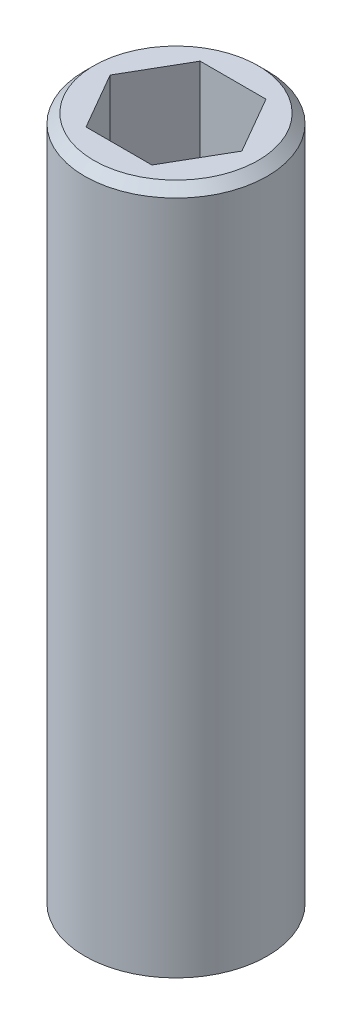
ISO-10303-21;
HEADER;
FILE_DESCRIPTION(('STEP AP214'),'2;1');
FILE_NAME('part.step','',(''),(''),'','','');
FILE_SCHEMA(('AUTOMOTIVE_DESIGN { 1 0 10303 214 1 1 1 1 }'));
ENDSEC;
DATA;
#1=APPLICATION_CONTEXT('core data for automotive mechanical design processes');
#2=APPLICATION_PROTOCOL_DEFINITION('international standard','automotive_design',2000,#1);
#3=PRODUCT_CONTEXT('',#1,'mechanical');
#4=PRODUCT('Part','Part','',(#3));
#5=PRODUCT_RELATED_PRODUCT_CATEGORY('part','',(#4));
#6=PRODUCT_DEFINITION_FORMATION('','',#4);
#7=PRODUCT_DEFINITION_CONTEXT('part definition',#1,'design');
#8=PRODUCT_DEFINITION('design','',#6,#7);
#9=PRODUCT_DEFINITION_SHAPE('','',#8);
#10=(LENGTH_UNIT() NAMED_UNIT(*) SI_UNIT(.MILLI.,.METRE.));
#11=(NAMED_UNIT(*) PLANE_ANGLE_UNIT() SI_UNIT($,.RADIAN.));
#12=(NAMED_UNIT(*) SI_UNIT($,.STERADIAN.) SOLID_ANGLE_UNIT());
#13=UNCERTAINTY_MEASURE_WITH_UNIT(LENGTH_MEASURE(1.E-05),#10,'distance_accuracy_value','');
#14=(GEOMETRIC_REPRESENTATION_CONTEXT(3) GLOBAL_UNCERTAINTY_ASSIGNED_CONTEXT((#13)) GLOBAL_UNIT_ASSIGNED_CONTEXT((#10,
#11,#12)) REPRESENTATION_CONTEXT('',''));
#15=CARTESIAN_POINT('',(0.,0.,0.));
#16=DIRECTION('',(0.,0.,1.));
#17=DIRECTION('',(1.,0.,0.));
#18=AXIS2_PLACEMENT_3D('',#15,#16,#17);
#19=CARTESIAN_POINT('',(0.,7.5,0.));
#20=DIRECTION('',(0.,-1.,0.));
#21=DIRECTION('',(0.,0.,-1.));
#22=AXIS2_PLACEMENT_3D('',#19,#20,#21);
#23=CYLINDRICAL_SURFACE('',#22,2.);
#24=CARTESIAN_POINT('',(0.,7.3,0.));
#25=DIRECTION('',(0.,1.,0.));
#26=DIRECTION('',(0.,0.,1.));
#27=AXIS2_PLACEMENT_3D('',#24,#25,#26);
#28=CIRCLE('',#27,2.);
#29=CARTESIAN_POINT('',(0.,7.3,2.));
#30=VERTEX_POINT('',#29);
#31=EDGE_CURVE('E11',#30,#30,#28,.F.);
#32=ORIENTED_EDGE('',*,*,#31,.T.);
#33=EDGE_LOOP('',(#32));
#34=FACE_BOUND('',#33,.T.);
#35=CARTESIAN_POINT('',(0.,-7.5,0.));
#36=DIRECTION('',(0.,1.,0.));
#37=DIRECTION('',(0.,0.,1.));
#38=AXIS2_PLACEMENT_3D('',#35,#36,#37);
#39=CIRCLE('',#38,2.);
#40=CARTESIAN_POINT('',(0.,-7.5,2.));
#41=VERTEX_POINT('',#40);
#42=EDGE_CURVE('E141',#41,#41,#39,.T.);
#43=ORIENTED_EDGE('',*,*,#42,.T.);
#44=EDGE_LOOP('',(#43));
#45=FACE_BOUND('',#44,.T.);
#46=ADVANCED_FACE('F39',(#34,#45),#23,.T.);
#47=CARTESIAN_POINT('',(0.,7.5,0.));
#48=DIRECTION('',(0.,1.,0.));
#49=DIRECTION('',(0.,0.,1.));
#50=AXIS2_PLACEMENT_3D('',#47,#48,#49);
#51=PLANE('',#50);
#52=CARTESIAN_POINT('',(0.,7.5,0.));
#53=DIRECTION('',(0.,1.,0.));
#54=DIRECTION('',(0.,0.,1.));
#55=AXIS2_PLACEMENT_3D('',#52,#53,#54);
#56=CIRCLE('',#55,1.8);
#57=CARTESIAN_POINT('',(0.,7.5,1.8));
#58=VERTEX_POINT('',#57);
#59=EDGE_CURVE('E47',#58,#58,#56,.T.);
#60=ORIENTED_EDGE('',*,*,#59,.T.);
#61=EDGE_LOOP('',(#60));
#62=FACE_BOUND('',#61,.T.);
#63=DIRECTION('',(-0.5,0.,-0.866025403784439));
#64=VECTOR('',#63,1.);
#65=CARTESIAN_POINT('',(1.44337567297406,7.5,0.));
#66=LINE('',#65,#64);
#67=CARTESIAN_POINT('',(1.44337567297406,7.5,0.));
#68=VERTEX_POINT('',#67);
#69=CARTESIAN_POINT('',(0.721687836487032,7.5,-1.25));
#70=VERTEX_POINT('',#69);
#71=EDGE_CURVE('E54',#68,#70,#66,.T.);
#72=ORIENTED_EDGE('',*,*,#71,.F.);
#73=DIRECTION('',(0.5,0.,-0.866025403784439));
#74=VECTOR('',#73,1.);
#75=CARTESIAN_POINT('',(0.721687836487032,7.5,1.25));
#76=LINE('',#75,#74);
#77=CARTESIAN_POINT('',(0.721687836487032,7.5,1.25));
#78=VERTEX_POINT('',#77);
#79=EDGE_CURVE('E137',#78,#68,#76,.T.);
#80=ORIENTED_EDGE('',*,*,#79,.F.);
#81=DIRECTION('',(1.,0.,0.));
#82=VECTOR('',#81,1.);
#83=CARTESIAN_POINT('',(-0.721687836487032,7.5,1.25));
#84=LINE('',#83,#82);
#85=CARTESIAN_POINT('',(-0.721687836487032,7.5,1.25));
#86=VERTEX_POINT('',#85);
#87=EDGE_CURVE('E135',#86,#78,#84,.T.);
#88=ORIENTED_EDGE('',*,*,#87,.F.);
#89=DIRECTION('',(0.5,0.,0.866025403784439));
#90=VECTOR('',#89,1.);
#91=CARTESIAN_POINT('',(-1.44337567297406,7.5,0.));
#92=LINE('',#91,#90);
#93=CARTESIAN_POINT('',(-1.44337567297406,7.5,0.));
#94=VERTEX_POINT('',#93);
#95=EDGE_CURVE('E102',#94,#86,#92,.T.);
#96=ORIENTED_EDGE('',*,*,#95,.F.);
#97=DIRECTION('',(-0.5,0.,0.866025403784439));
#98=VECTOR('',#97,1.);
#99=CARTESIAN_POINT('',(-0.721687836487032,7.5,-1.25));
#100=LINE('',#99,#98);
#101=CARTESIAN_POINT('',(-0.721687836487032,7.5,-1.25));
#102=VERTEX_POINT('',#101);
#103=EDGE_CURVE('E131',#102,#94,#100,.T.);
#104=ORIENTED_EDGE('',*,*,#103,.F.);
#105=DIRECTION('',(-1.,0.,0.));
#106=VECTOR('',#105,1.);
#107=CARTESIAN_POINT('',(0.721687836487032,7.5,-1.25));
#108=LINE('',#107,#106);
#109=EDGE_CURVE('E128',#70,#102,#108,.T.);
#110=ORIENTED_EDGE('',*,*,#109,.F.);
#111=EDGE_LOOP('',(#72,#80,#88,#96,#104,#110));
#112=FACE_BOUND('',#111,.T.);
#113=ADVANCED_FACE('F151',(#62,#112),#51,.T.);
#114=CARTESIAN_POINT('',(0.,-7.5,0.));
#115=DIRECTION('',(0.,1.,0.));
#116=DIRECTION('',(0.,0.,1.));
#117=AXIS2_PLACEMENT_3D('',#114,#115,#116);
#118=PLANE('',#117);
#119=ORIENTED_EDGE('',*,*,#42,.F.);
#120=EDGE_LOOP('',(#119));
#121=FACE_BOUND('',#120,.T.);
#122=ADVANCED_FACE('F167',(#121),#118,.F.);
#123=CARTESIAN_POINT('',(1.44337567297406,5.5,0.));
#124=DIRECTION('',(0.866025403784439,0.,-0.5));
#125=DIRECTION('',(-0.5,0.,-0.866025403784439));
#126=AXIS2_PLACEMENT_3D('',#123,#124,#125);
#127=PLANE('',#126);
#128=ORIENTED_EDGE('',*,*,#71,.T.);
#129=DIRECTION('',(0.,1.,0.));
#130=VECTOR('',#129,1.);
#131=CARTESIAN_POINT('',(0.721687836487032,5.5,-1.25));
#132=LINE('',#131,#130);
#133=CARTESIAN_POINT('',(0.721687836487032,5.5,-1.25));
#134=VERTEX_POINT('',#133);
#135=EDGE_CURVE('E84',#134,#70,#132,.T.);
#136=ORIENTED_EDGE('',*,*,#135,.F.);
#137=DIRECTION('',(-0.5,0.,-0.866025403784439));
#138=VECTOR('',#137,1.);
#139=CARTESIAN_POINT('',(1.44337567297406,5.5,0.));
#140=LINE('',#139,#138);
#141=CARTESIAN_POINT('',(1.44337567297406,5.5,0.));
#142=VERTEX_POINT('',#141);
#143=EDGE_CURVE('E139',#142,#134,#140,.T.);
#144=ORIENTED_EDGE('',*,*,#143,.F.);
#145=DIRECTION('',(0.,1.,0.));
#146=VECTOR('',#145,1.);
#147=CARTESIAN_POINT('',(1.44337567297406,5.5,0.));
#148=LINE('',#147,#146);
#149=EDGE_CURVE('E62',#142,#68,#148,.T.);
#150=ORIENTED_EDGE('',*,*,#149,.T.);
#151=EDGE_LOOP('',(#128,#136,#144,#150));
#152=FACE_BOUND('',#151,.T.);
#153=ADVANCED_FACE('F172',(#152),#127,.F.);
#154=CARTESIAN_POINT('',(0.721687836487032,5.5,1.25));
#155=DIRECTION('',(0.866025403784439,0.,0.5));
#156=DIRECTION('',(0.5,0.,-0.866025403784439));
#157=AXIS2_PLACEMENT_3D('',#154,#155,#156);
#158=PLANE('',#157);
#159=ORIENTED_EDGE('',*,*,#79,.T.);
#160=ORIENTED_EDGE('',*,*,#149,.F.);
#161=DIRECTION('',(0.5,0.,-0.866025403784439));
#162=VECTOR('',#161,1.);
#163=CARTESIAN_POINT('',(0.721687836487032,5.5,1.25));
#164=LINE('',#163,#162);
#165=CARTESIAN_POINT('',(0.721687836487032,5.5,1.25));
#166=VERTEX_POINT('',#165);
#167=EDGE_CURVE('E114',#166,#142,#164,.T.);
#168=ORIENTED_EDGE('',*,*,#167,.F.);
#169=DIRECTION('',(0.,1.,0.));
#170=VECTOR('',#169,1.);
#171=CARTESIAN_POINT('',(0.721687836487032,5.5,1.25));
#172=LINE('',#171,#170);
#173=EDGE_CURVE('E106',#166,#78,#172,.T.);
#174=ORIENTED_EDGE('',*,*,#173,.T.);
#175=EDGE_LOOP('',(#159,#160,#168,#174));
#176=FACE_BOUND('',#175,.T.);
#177=ADVANCED_FACE('F177',(#176),#158,.F.);
#178=CARTESIAN_POINT('',(-0.721687836487032,5.5,1.25));
#179=DIRECTION('',(0.,0.,1.));
#180=DIRECTION('',(1.,0.,0.));
#181=AXIS2_PLACEMENT_3D('',#178,#179,#180);
#182=PLANE('',#181);
#183=ORIENTED_EDGE('',*,*,#87,.T.);
#184=ORIENTED_EDGE('',*,*,#173,.F.);
#185=DIRECTION('',(1.,0.,0.));
#186=VECTOR('',#185,1.);
#187=CARTESIAN_POINT('',(-0.721687836487032,5.5,1.25));
#188=LINE('',#187,#186);
#189=CARTESIAN_POINT('',(-0.721687836487032,5.5,1.25));
#190=VERTEX_POINT('',#189);
#191=EDGE_CURVE('E110',#190,#166,#188,.T.);
#192=ORIENTED_EDGE('',*,*,#191,.F.);
#193=DIRECTION('',(0.,1.,0.));
#194=VECTOR('',#193,1.);
#195=CARTESIAN_POINT('',(-0.721687836487032,5.5,1.25));
#196=LINE('',#195,#194);
#197=EDGE_CURVE('E95',#190,#86,#196,.T.);
#198=ORIENTED_EDGE('',*,*,#197,.T.);
#199=EDGE_LOOP('',(#183,#184,#192,#198));
#200=FACE_BOUND('',#199,.T.);
#201=ADVANCED_FACE('F111',(#200),#182,.F.);
#202=CARTESIAN_POINT('',(-1.44337567297406,5.5,0.));
#203=DIRECTION('',(-0.866025403784439,0.,0.5));
#204=DIRECTION('',(0.5,0.,0.866025403784439));
#205=AXIS2_PLACEMENT_3D('',#202,#203,#204);
#206=PLANE('',#205);
#207=ORIENTED_EDGE('',*,*,#95,.T.);
#208=ORIENTED_EDGE('',*,*,#197,.F.);
#209=DIRECTION('',(0.5,0.,0.866025403784439));
#210=VECTOR('',#209,1.);
#211=CARTESIAN_POINT('',(-1.44337567297406,5.5,0.));
#212=LINE('',#211,#210);
#213=CARTESIAN_POINT('',(-1.44337567297406,5.5,0.));
#214=VERTEX_POINT('',#213);
#215=EDGE_CURVE('E99',#214,#190,#212,.T.);
#216=ORIENTED_EDGE('',*,*,#215,.F.);
#217=DIRECTION('',(0.,1.,0.));
#218=VECTOR('',#217,1.);
#219=CARTESIAN_POINT('',(-1.44337567297406,5.5,0.));
#220=LINE('',#219,#218);
#221=EDGE_CURVE('E107',#214,#94,#220,.T.);
#222=ORIENTED_EDGE('',*,*,#221,.T.);
#223=EDGE_LOOP('',(#207,#208,#216,#222));
#224=FACE_BOUND('',#223,.T.);
#225=ADVANCED_FACE('F97',(#224),#206,.F.);
#226=CARTESIAN_POINT('',(-0.721687836487032,5.5,-1.25));
#227=DIRECTION('',(-0.866025403784439,0.,-0.5));
#228=DIRECTION('',(-0.5,0.,0.866025403784439));
#229=AXIS2_PLACEMENT_3D('',#226,#227,#228);
#230=PLANE('',#229);
#231=ORIENTED_EDGE('',*,*,#103,.T.);
#232=ORIENTED_EDGE('',*,*,#221,.F.);
#233=DIRECTION('',(-0.5,0.,0.866025403784439));
#234=VECTOR('',#233,1.);
#235=CARTESIAN_POINT('',(-0.721687836487032,5.5,-1.25));
#236=LINE('',#235,#234);
#237=CARTESIAN_POINT('',(-0.721687836487032,5.5,-1.25));
#238=VERTEX_POINT('',#237);
#239=EDGE_CURVE('E120',#238,#214,#236,.T.);
#240=ORIENTED_EDGE('',*,*,#239,.F.);
#241=DIRECTION('',(0.,1.,0.));
#242=VECTOR('',#241,1.);
#243=CARTESIAN_POINT('',(-0.721687836487032,5.5,-1.25));
#244=LINE('',#243,#242);
#245=EDGE_CURVE('E144',#238,#102,#244,.T.);
#246=ORIENTED_EDGE('',*,*,#245,.T.);
#247=EDGE_LOOP('',(#231,#232,#240,#246));
#248=FACE_BOUND('',#247,.T.);
#249=ADVANCED_FACE('F180',(#248),#230,.F.);
#250=CARTESIAN_POINT('',(0.721687836487032,5.5,-1.25));
#251=DIRECTION('',(0.,0.,-1.));
#252=DIRECTION('',(-1.,0.,0.));
#253=AXIS2_PLACEMENT_3D('',#250,#251,#252);
#254=PLANE('',#253);
#255=ORIENTED_EDGE('',*,*,#109,.T.);
#256=ORIENTED_EDGE('',*,*,#245,.F.);
#257=DIRECTION('',(-1.,0.,0.));
#258=VECTOR('',#257,1.);
#259=CARTESIAN_POINT('',(0.721687836487032,5.5,-1.25));
#260=LINE('',#259,#258);
#261=EDGE_CURVE('E122',#134,#238,#260,.T.);
#262=ORIENTED_EDGE('',*,*,#261,.F.);
#263=ORIENTED_EDGE('',*,*,#135,.T.);
#264=EDGE_LOOP('',(#255,#256,#262,#263));
#265=FACE_BOUND('',#264,.T.);
#266=ADVANCED_FACE('F159',(#265),#254,.F.);
#267=CARTESIAN_POINT('',(0.,5.5,0.));
#268=DIRECTION('',(0.,1.,0.));
#269=DIRECTION('',(0.,0.,1.));
#270=AXIS2_PLACEMENT_3D('',#267,#268,#269);
#271=PLANE('',#270);
#272=ORIENTED_EDGE('',*,*,#143,.T.);
#273=ORIENTED_EDGE('',*,*,#261,.T.);
#274=ORIENTED_EDGE('',*,*,#239,.T.);
#275=ORIENTED_EDGE('',*,*,#215,.T.);
#276=ORIENTED_EDGE('',*,*,#191,.T.);
#277=ORIENTED_EDGE('',*,*,#167,.T.);
#278=EDGE_LOOP('',(#272,#273,#274,#275,#276,#277));
#279=FACE_BOUND('',#278,.T.);
#280=ADVANCED_FACE('F117',(#279),#271,.T.);
#281=CARTESIAN_POINT('',(0.,7.5,0.));
#282=DIRECTION('',(0.,-1.,0.));
#283=DIRECTION('',(0.,0.,-1.));
#284=AXIS2_PLACEMENT_3D('',#281,#282,#283);
#285=CONICAL_SURFACE('',#284,1.8,0.785398163397449);
#286=ORIENTED_EDGE('',*,*,#31,.F.);
#287=EDGE_LOOP('',(#286));
#288=FACE_BOUND('',#287,.T.);
#289=ORIENTED_EDGE('',*,*,#59,.F.);
#290=EDGE_LOOP('',(#289));
#291=FACE_BOUND('',#290,.T.);
#292=ADVANCED_FACE('F41',(#288,#291),#285,.T.);
#293=CLOSED_SHELL('',(#46,#113,#122,#153,#177,#201,#225,#249,#266,#280,#292));
#294=MANIFOLD_SOLID_BREP('B2',#293);
#295=ADVANCED_BREP_SHAPE_REPRESENTATION('',(#18,#294),#14);
#296=SHAPE_DEFINITION_REPRESENTATION(#9,#295);
ENDSEC;
END-ISO-10303-21;
